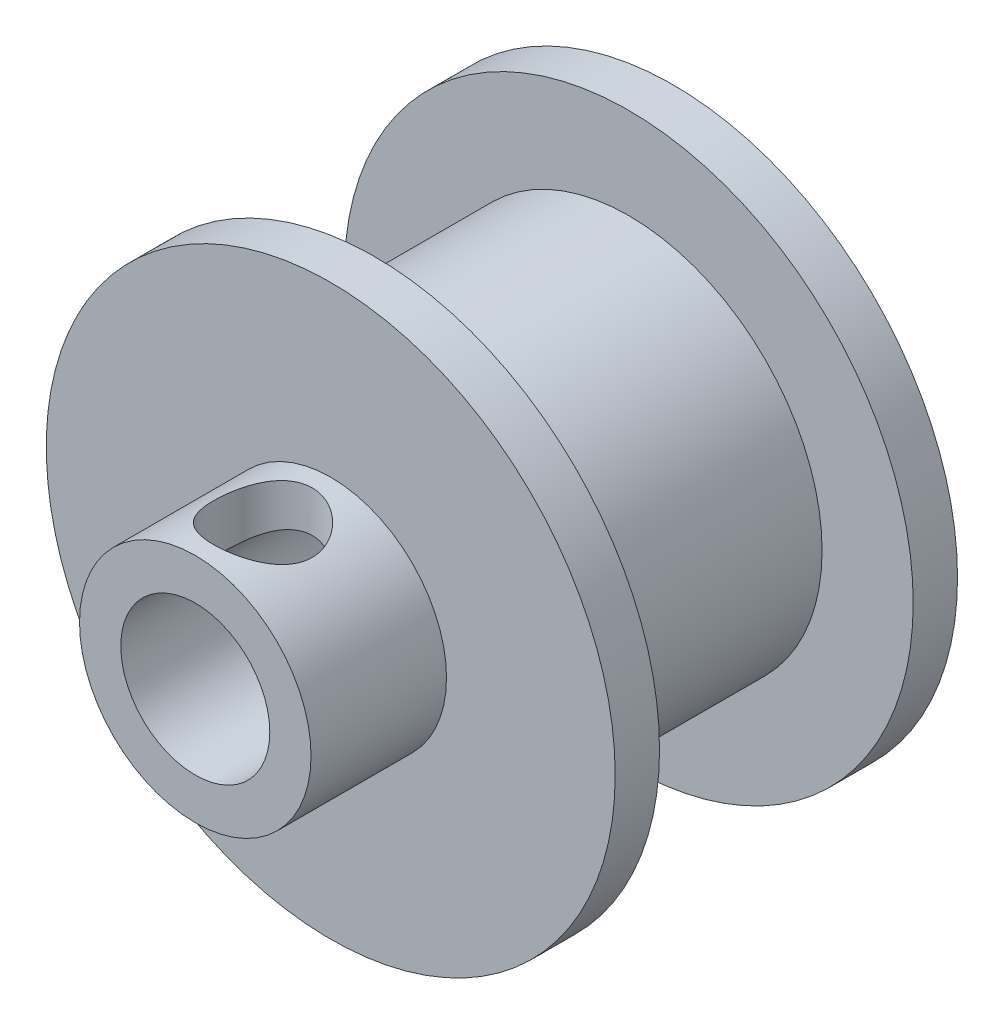
ISO-10303-21;
HEADER;
FILE_DESCRIPTION(('STEP AP214'),'2;1');
FILE_NAME('part.step','',(''),(''),'','','');
FILE_SCHEMA(('AUTOMOTIVE_DESIGN { 1 0 10303 214 1 1 1 1 }'));
ENDSEC;
DATA;
#1=APPLICATION_CONTEXT('core data for automotive mechanical design processes');
#2=APPLICATION_PROTOCOL_DEFINITION('international standard','automotive_design',2000,#1);
#3=PRODUCT_CONTEXT('',#1,'mechanical');
#4=PRODUCT('Part','Part','',(#3));
#5=PRODUCT_RELATED_PRODUCT_CATEGORY('part','',(#4));
#6=PRODUCT_DEFINITION_FORMATION('','',#4);
#7=PRODUCT_DEFINITION_CONTEXT('part definition',#1,'design');
#8=PRODUCT_DEFINITION('design','',#6,#7);
#9=PRODUCT_DEFINITION_SHAPE('','',#8);
#10=(LENGTH_UNIT() NAMED_UNIT(*) SI_UNIT(.MILLI.,.METRE.));
#11=(NAMED_UNIT(*) PLANE_ANGLE_UNIT() SI_UNIT($,.RADIAN.));
#12=(NAMED_UNIT(*) SI_UNIT($,.STERADIAN.) SOLID_ANGLE_UNIT());
#13=UNCERTAINTY_MEASURE_WITH_UNIT(LENGTH_MEASURE(1.E-05),#10,'distance_accuracy_value','');
#14=(GEOMETRIC_REPRESENTATION_CONTEXT(3) GLOBAL_UNCERTAINTY_ASSIGNED_CONTEXT((#13)) GLOBAL_UNIT_ASSIGNED_CONTEXT((#10,
#11,#12)) REPRESENTATION_CONTEXT('',''));
#15=CARTESIAN_POINT('',(0.,0.,0.));
#16=DIRECTION('',(0.,0.,1.));
#17=DIRECTION('',(1.,0.,0.));
#18=AXIS2_PLACEMENT_3D('',#15,#16,#17);
#19=CARTESIAN_POINT('',(0.,0.,6.95));
#20=DIRECTION('',(0.,0.,-1.));
#21=DIRECTION('',(-1.,0.,0.));
#22=AXIS2_PLACEMENT_3D('',#19,#20,#21);
#23=CYLINDRICAL_SURFACE('',#22,3.025);
#24=CARTESIAN_POINT('',(0.,0.,12.45));
#25=DIRECTION('',(0.,0.,1.));
#26=DIRECTION('',(1.,0.,0.));
#27=AXIS2_PLACEMENT_3D('',#24,#25,#26);
#28=CIRCLE('',#27,3.025);
#29=CARTESIAN_POINT('',(3.025,0.,12.45));
#30=VERTEX_POINT('',#29);
#31=EDGE_CURVE('E88',#30,#30,#28,.T.);
#32=ORIENTED_EDGE('',*,*,#31,.T.);
#33=EDGE_LOOP('',(#32));
#34=FACE_BOUND('',#33,.T.);
#35=CARTESIAN_POINT('',(0.,0.,-6.95));
#36=DIRECTION('',(0.,0.,1.));
#37=DIRECTION('',(1.,0.,0.));
#38=AXIS2_PLACEMENT_3D('',#35,#36,#37);
#39=CIRCLE('',#38,3.025);
#40=CARTESIAN_POINT('',(3.025,0.,-6.95));
#41=VERTEX_POINT('',#40);
#42=EDGE_CURVE('E62',#41,#41,#39,.T.);
#43=ORIENTED_EDGE('',*,*,#42,.F.);
#44=EDGE_LOOP('',(#43));
#45=FACE_BOUND('',#44,.T.);
#46=CARTESIAN_POINT('',(0.,3.025,7.7));
#47=CARTESIAN_POINT('',(-0.100642617545443,3.0249987783567,7.70000120399706));
#48=CARTESIAN_POINT('',(-0.201297476451969,3.01993299908086,7.70763918314827));
#49=CARTESIAN_POINT('',(-0.399407420799123,3.00017112360042,7.73772383693425));
#50=CARTESIAN_POINT('',(-0.496860581658116,2.98546934240776,7.76017925352083));
#51=CARTESIAN_POINT('',(-0.685406514791431,2.94788928584531,7.81853239841244));
#52=CARTESIAN_POINT('',(-0.77652679162158,2.9250494038349,7.85436704448431));
#53=CARTESIAN_POINT('',(-0.951102248223408,2.87303630646243,7.93796086625516));
#54=CARTESIAN_POINT('',(-1.03455640299659,2.84386224593824,7.98572163337046));
#55=CARTESIAN_POINT('',(-1.1993664317277,2.77860517215513,8.09619850933004));
#56=CARTESIAN_POINT('',(-1.27995339778043,2.74214718793265,8.15983549631194));
#57=CARTESIAN_POINT('',(-1.43004114549588,2.66695898812271,8.29806837761625));
#58=CARTESIAN_POINT('',(-1.49952590979975,2.62822559792703,8.37267981240007));
#59=CARTESIAN_POINT('',(-1.63642694811529,2.54559569213749,8.54416649867465));
#60=CARTESIAN_POINT('',(-1.70185902015384,2.50182778570157,8.64270030985283));
#61=CARTESIAN_POINT('',(-1.81513895163526,2.42089760145931,8.85185343247864));
#62=CARTESIAN_POINT('',(-1.86301722866889,2.38372395524591,8.96245140311269));
#63=CARTESIAN_POINT('',(-1.92790941909835,2.33131127968343,9.16080288815675));
#64=CARTESIAN_POINT('',(-1.94983031145749,2.3128404086022,9.24608882179241));
#65=CARTESIAN_POINT('',(-1.98230173644163,2.28507624082387,9.42019621834675));
#66=CARTESIAN_POINT('',(-1.99287137832762,2.27576752231628,9.50901147754151));
#67=CARTESIAN_POINT('',(-2.00197996643278,2.26776224993919,9.68810230830303));
#68=CARTESIAN_POINT('',(-2.00047243567843,2.26910669275792,9.77838218574456));
#69=CARTESIAN_POINT('',(-1.98542700585713,2.28227832992203,9.95718548618679));
#70=CARTESIAN_POINT('',(-1.97187893783001,2.29411438504498,10.0457073598269));
#71=CARTESIAN_POINT('',(-1.93441748703559,2.32577203848501,10.2150249556095));
#72=CARTESIAN_POINT('',(-1.91095118389035,2.3452468580049,10.2959886169975));
#73=CARTESIAN_POINT('',(-1.85474587741065,2.38994328199187,10.4529093217787));
#74=CARTESIAN_POINT('',(-1.82200382976829,2.41516677264586,10.5288647113465));
#75=CARTESIAN_POINT('',(-1.74062365832932,2.47464586658619,10.689914970672));
#76=CARTESIAN_POINT('',(-1.69011177897742,2.50969726935146,10.7737667143711));
#77=CARTESIAN_POINT('',(-1.57789269135683,2.58173148940282,10.9327776291153));
#78=CARTESIAN_POINT('',(-1.51617174973991,2.61871663588472,11.0079259496748));
#79=CARTESIAN_POINT('',(-1.36825223388174,2.69944551804657,11.1634469856888));
#80=CARTESIAN_POINT('',(-1.27963305562048,2.74299173909087,11.2416455785507));
#81=CARTESIAN_POINT('',(-1.08829088468167,2.82436277312043,11.3821621524632));
#82=CARTESIAN_POINT('',(-0.985581704313003,2.86219311394096,11.4444955172644));
#83=CARTESIAN_POINT('',(-0.789532778941591,2.92157423058359,11.5401294705185));
#84=CARTESIAN_POINT('',(-0.698331651394651,2.9448638502207,11.5767301836017));
#85=CARTESIAN_POINT('',(-0.509974561365831,2.98324682151488,11.6364045017915));
#86=CARTESIAN_POINT('',(-0.412823666926972,2.99834704378092,11.6594894474371));
#87=CARTESIAN_POINT('',(-0.214732767837397,3.01901724877256,11.6909754675224));
#88=CARTESIAN_POINT('',(-0.11377891660282,3.02454808313808,11.6993162265056));
#89=CARTESIAN_POINT('',(0.08827490320082,3.02539816006898,11.7006024658699));
#90=CARTESIAN_POINT('',(0.189374865880597,3.02071780334157,11.6935485503683));
#91=CARTESIAN_POINT('',(0.381767939018031,3.00226630998737,11.6654713815535));
#92=CARTESIAN_POINT('',(0.473265865733121,2.9891210741874,11.6454093059232));
#93=CARTESIAN_POINT('',(0.651304981345674,2.95544286376606,11.5932545777779));
#94=CARTESIAN_POINT('',(0.737845372463179,2.93490870394887,11.5611599951939));
#95=CARTESIAN_POINT('',(0.909671296368378,2.88645021717455,11.4837986244011));
#96=CARTESIAN_POINT('',(0.994525548315689,2.85813838308447,11.4378228543548));
#97=CARTESIAN_POINT('',(1.15562685582589,2.79688987995517,11.3351349952313));
#98=CARTESIAN_POINT('',(1.23186824324879,2.76395019694144,11.2784159009105));
#99=CARTESIAN_POINT('',(1.38625078703641,2.69023227350938,11.1457657904491));
#100=CARTESIAN_POINT('',(1.46280246171431,2.64903627604967,11.0682160416802));
#101=CARTESIAN_POINT('',(1.60248518218092,2.56694988781008,10.9016111254721));
#102=CARTESIAN_POINT('',(1.66560818311131,2.52605969430337,10.8125491123265));
#103=CARTESIAN_POINT('',(1.77180282800471,2.45256947866062,10.6330116479057));
#104=CARTESIAN_POINT('',(1.81622554222599,2.41955004513944,10.5435113156178));
#105=CARTESIAN_POINT('',(1.89174612763738,2.36097775731043,10.3568040613348));
#106=CARTESIAN_POINT('',(1.92286805386102,2.33541145056868,10.2596114318735));
#107=CARTESIAN_POINT('',(1.96611703059194,2.29905930446256,10.0763918780719));
#108=CARTESIAN_POINT('',(1.98057383955256,2.2864996133779,9.99127578933898));
#109=CARTESIAN_POINT('',(1.99832459579881,2.27100707562216,9.81905002442775));
#110=CARTESIAN_POINT('',(2.00162949221253,2.26806478651924,9.73194238825282));
#111=CARTESIAN_POINT('',(1.99686400840466,2.27226006140056,9.55828636602112));
#112=CARTESIAN_POINT('',(1.98879215912862,2.27939892714264,9.47173805363841));
#113=CARTESIAN_POINT('',(1.96180765860033,2.30265967673578,9.30155537000174));
#114=CARTESIAN_POINT('',(1.94288066764141,2.31879344211434,9.21792500870731));
#115=CARTESIAN_POINT('',(1.88853640463144,2.36338668506866,9.03281773634975));
#116=CARTESIAN_POINT('',(1.85000940230073,2.39401916394776,8.93278671871945));
#117=CARTESIAN_POINT('',(1.75875296775858,2.4618364901973,8.74186280751888));
#118=CARTESIAN_POINT('',(1.70600376756291,2.49903043253554,8.65098287671915));
#119=CARTESIAN_POINT('',(1.58660143921209,2.57652397210842,8.47772806406638));
#120=CARTESIAN_POINT('',(1.51972274368281,2.61686628824137,8.39552830736307));
#121=CARTESIAN_POINT('',(1.37352970310745,2.69647449530486,8.2423909046251));
#122=CARTESIAN_POINT('',(1.29421174234046,2.73574006934783,8.17145654520685));
#123=CARTESIAN_POINT('',(1.11295786075001,2.81477128758288,8.03390374857185));
#124=CARTESIAN_POINT('',(1.00942412682184,2.85394790411945,7.96902276178672));
#125=CARTESIAN_POINT('',(0.789646169800204,2.9223698098855,7.85839465354481));
#126=CARTESIAN_POINT('',(0.673425510575372,2.95163311005191,7.81261279654635));
#127=CARTESIAN_POINT('',(0.463954469027434,2.99057955194841,7.75235804291387));
#128=CARTESIAN_POINT('',(0.372726683285134,3.00339087807589,7.73281288538721));
#129=CARTESIAN_POINT('',(0.187668467681293,3.02059926936491,7.70663698970701));
#130=CARTESIAN_POINT('',(0.0938395550181366,3.02500113906481,7.69999887738861));
#131=CARTESIAN_POINT('',(0.,3.025,7.7));
#132=B_SPLINE_CURVE_WITH_KNOTS('',3,(#46,#47,#48,#49,#50,#51,#52,#53,#54,#55,#56,#57,#58,#59,
#60,#61,#62,#63,#64,#65,#66,#67,#68,#69,#70,#71,#72,#73,#74,#75,#76,#77,#78,#79,#80,#81,#82,#83,
#84,#85,#86,#87,#88,#89,#90,#91,#92,#93,#94,#95,#96,#97,#98,#99,#100,#101,#102,#103,#104,#105,
#106,#107,#108,#109,#110,#111,#112,#113,#114,#115,#116,#117,#118,#119,#120,#121,#122,#123,#124,
#125,#126,#127,#128,#129,#130,#131),.UNSPECIFIED.,.T.,.F.,(4,2,2,2,2,2,2,2,2,2,2,2,2,2,2,2,2,2,
2,2,2,2,2,2,2,2,2,2,2,2,2,2,2,2,2,2,2,2,2,2,2,2,4),(0.,0.3015487261854,0.603275518532284,
0.90359729337094,1.20395916445007,1.5296221539219,1.85575082198353,2.23234945588228,
2.60829239236122,2.87713902044292,3.14553234581872,3.41495903262255,3.68461348298609,
3.94322790551536,4.20192730406332,4.51276392728465,4.8239839889588,5.20005220793538,
5.57575437031097,5.87746307605224,6.17891826595882,6.4816038183107,6.78427749289961,
7.06680260771108,7.3493730602407,7.64994767467169,7.95071895936767,8.29882678891969,
8.64714257948896,8.96167116055969,9.27562847127143,9.53621105204697,9.79653771407238,
10.0568979945935,10.3176030073973,10.6502710247593,10.983403835499,11.3223223758499,
11.6613396128591,12.0440942372523,12.4261496795824,12.7074756225657,12.9886407886918),.UNSPECIFIED.);
#133=CARTESIAN_POINT('',(0.,3.025,7.7));
#134=VERTEX_POINT('',#133);
#135=EDGE_CURVE('E86',#134,#134,#132,.T.);
#136=ORIENTED_EDGE('',*,*,#135,.T.);
#137=EDGE_LOOP('',(#136));
#138=FACE_BOUND('',#137,.T.);
#139=ADVANCED_FACE('F44',(#34,#45,#138),#23,.F.);
#140=CARTESIAN_POINT('',(0.,0.,12.45));
#141=DIRECTION('',(0.,0.,-1.));
#142=DIRECTION('',(-1.,0.,0.));
#143=AXIS2_PLACEMENT_3D('',#140,#141,#142);
#144=CYLINDRICAL_SURFACE('',#143,4.7);
#145=CARTESIAN_POINT('',(0.,0.,12.45));
#146=DIRECTION('',(0.,0.,1.));
#147=DIRECTION('',(1.,0.,0.));
#148=AXIS2_PLACEMENT_3D('',#145,#146,#147);
#149=CIRCLE('',#148,4.7);
#150=CARTESIAN_POINT('',(4.7,0.,12.45));
#151=VERTEX_POINT('',#150);
#152=EDGE_CURVE('E152',#151,#151,#149,.T.);
#153=ORIENTED_EDGE('',*,*,#152,.F.);
#154=EDGE_LOOP('',(#153));
#155=FACE_BOUND('',#154,.T.);
#156=CARTESIAN_POINT('',(0.,0.,6.95));
#157=DIRECTION('',(0.,0.,1.));
#158=DIRECTION('',(1.,0.,0.));
#159=AXIS2_PLACEMENT_3D('',#156,#157,#158);
#160=CIRCLE('',#159,4.7);
#161=CARTESIAN_POINT('',(4.7,0.,6.95));
#162=VERTEX_POINT('',#161);
#163=EDGE_CURVE('E91',#162,#162,#160,.T.);
#164=ORIENTED_EDGE('',*,*,#163,.T.);
#165=EDGE_LOOP('',(#164));
#166=FACE_BOUND('',#165,.T.);
#167=CARTESIAN_POINT('',(0.,4.7,7.7));
#168=CARTESIAN_POINT('',(-0.10692485662613,4.69999666346683,7.70000417760869));
#169=CARTESIAN_POINT('',(-0.214029147523676,4.69630997958722,7.70862509214498));
#170=CARTESIAN_POINT('',(-0.425181969338198,4.68193129468864,7.74277903621876));
#171=CARTESIAN_POINT('',(-0.529222010676268,4.67122145225011,7.76835514001884));
#172=CARTESIAN_POINT('',(-0.730857018166164,4.6439382867363,7.83530438478649));
#173=CARTESIAN_POINT('',(-0.828472851638892,4.62738518558675,7.87662308355906));
#174=CARTESIAN_POINT('',(-1.01528873528886,4.59001917808983,7.97365253204055));
#175=CARTESIAN_POINT('',(-1.10449112492873,4.56920746103547,8.02935926477567));
#176=CARTESIAN_POINT('',(-1.27672442730341,4.52418738012171,8.15663434582691));
#177=CARTESIAN_POINT('',(-1.35926174130374,4.49986471050801,8.2288298481395));
#178=CARTESIAN_POINT('',(-1.51148486557321,4.45104663598243,8.38570539203694));
#179=CARTESIAN_POINT('',(-1.58116363688477,4.42655114403707,8.47039222619485));
#180=CARTESIAN_POINT('',(-1.70926620438313,4.37873614072174,8.65516211964604));
#181=CARTESIAN_POINT('',(-1.76691948260528,4.35554338207605,8.75581566372163));
#182=CARTESIAN_POINT('',(-1.86425663183146,4.31478302503359,8.96651927893424));
#183=CARTESIAN_POINT('',(-1.90395015104001,4.29721240784208,9.07656426701224));
#184=CARTESIAN_POINT('',(-1.96218047468407,4.27092831245099,9.29724464154552));
#185=CARTESIAN_POINT('',(-1.98166946145791,4.26181855593757,9.40757970733334));
#186=CARTESIAN_POINT('',(-2.00190551580218,4.25235376934774,9.630300948235));
#187=CARTESIAN_POINT('',(-2.00266356932707,4.25199360751372,9.74268588235903));
#188=CARTESIAN_POINT('',(-1.98613114332845,4.25973480930859,9.95663895816199));
#189=CARTESIAN_POINT('',(-1.97029063184602,4.26715642894014,10.0583487666607));
#190=CARTESIAN_POINT('',(-1.92345076957673,4.28847200647672,10.2574994197707));
#191=CARTESIAN_POINT('',(-1.89244836602801,4.30236726778646,10.3549394003694));
#192=CARTESIAN_POINT('',(-1.81555525499754,4.33538182828041,10.5452986664836));
#193=CARTESIAN_POINT('',(-1.76935615153357,4.35460791814086,10.6380740220482));
#194=CARTESIAN_POINT('',(-1.6636001351201,4.39609554669109,10.8149264994477));
#195=CARTESIAN_POINT('',(-1.60403783137094,4.41835830896888,10.8990000908782));
#196=CARTESIAN_POINT('',(-1.46706161105033,4.46580649160273,11.0638947819234));
#197=CARTESIAN_POINT('',(-1.38853428286767,4.49107619261281,11.143769424756));
#198=CARTESIAN_POINT('',(-1.21895987758281,4.54003526731224,11.2895413414367));
#199=CARTESIAN_POINT('',(-1.12790962219509,4.56372423754232,11.3554350561332));
#200=CARTESIAN_POINT('',(-0.932892208107861,4.60759525061253,11.4728448716456));
#201=CARTESIAN_POINT('',(-0.828658921880045,4.62767475219198,11.5239601132258));
#202=CARTESIAN_POINT('',(-0.611999597864047,4.66127045529352,11.6075949314454));
#203=CARTESIAN_POINT('',(-0.499578330107226,4.67479044353611,11.6401252388527));
#204=CARTESIAN_POINT('',(-0.277630042436054,4.69302696251971,11.683649108146));
#205=CARTESIAN_POINT('',(-0.168394456422568,4.69826133714206,11.6959118514077));
#206=CARTESIAN_POINT('',(0.0506909318671914,4.70100171313263,11.7023560092764));
#207=CARTESIAN_POINT('',(0.160540537963261,4.69851005621543,11.6965429025652));
#208=CARTESIAN_POINT('',(0.371686977978058,4.68641210333225,11.6678946833195));
#209=CARTESIAN_POINT('',(0.47313081948953,4.67718429534675,11.6459647109599));
#210=CARTESIAN_POINT('',(0.670779642565015,4.65295337017062,11.5869804824908));
#211=CARTESIAN_POINT('',(0.766983967852256,4.63794953139232,11.5499243366647));
#212=CARTESIAN_POINT('',(0.95481713723941,4.60301416311766,11.4605342764179));
#213=CARTESIAN_POINT('',(1.04620957436518,4.58294349394268,11.4077597640921));
#214=CARTESIAN_POINT('',(1.21917036985224,4.53999757346506,11.2889133644913));
#215=CARTESIAN_POINT('',(1.30073453226727,4.5171211326565,11.2228358297364));
#216=CARTESIAN_POINT('',(1.45810635459966,4.46891425913783,11.0735165514297));
#217=CARTESIAN_POINT('',(1.53303460911794,4.44352785937345,10.9893637034481));
#218=CARTESIAN_POINT('',(1.66796692006086,4.3946613909747,10.8093003437844));
#219=CARTESIAN_POINT('',(1.72796702854655,4.3711818277311,10.7133867318083));
#220=CARTESIAN_POINT('',(1.83214915735023,4.32856380704773,10.5102294872308));
#221=CARTESIAN_POINT('',(1.87604556209347,4.30950575213662,10.4028212490079));
#222=CARTESIAN_POINT('',(1.94474056712953,4.27895122845934,10.1810678501511));
#223=CARTESIAN_POINT('',(1.96955583238523,4.26744816264914,10.066728837061));
#224=CARTESIAN_POINT('',(1.99769489254577,4.25434295041792,9.84415969662034));
#225=CARTESIAN_POINT('',(2.00257140660816,4.25202592957534,9.73616724271675));
#226=CARTESIAN_POINT('',(1.99487613358543,4.25564197431861,9.52095810814777));
#227=CARTESIAN_POINT('',(1.9823073158831,4.26157363589046,9.41374129858159));
#228=CARTESIAN_POINT('',(1.94140075202275,4.28035344687555,9.20873501518394));
#229=CARTESIAN_POINT('',(1.91389354633939,4.29283623543807,9.11074306961365));
#230=CARTESIAN_POINT('',(1.84472274227802,4.3230098398554,8.92075278397802));
#231=CARTESIAN_POINT('',(1.8030551310714,4.34070213180871,8.8287561517038));
#232=CARTESIAN_POINT('',(1.70380013805169,4.38064955133802,8.64718446992673));
#233=CARTESIAN_POINT('',(1.64539111331458,4.40311841518084,8.55810652394598));
#234=CARTESIAN_POINT('',(1.51543520489265,4.44951830972454,8.3905312033708));
#235=CARTESIAN_POINT('',(1.4438834576808,4.47344987951198,8.31203776433212));
#236=CARTESIAN_POINT('',(1.28311316784953,4.52230061095796,8.16160685512554));
#237=CARTESIAN_POINT('',(1.19295633781391,4.54715303874267,8.09064571060983));
#238=CARTESIAN_POINT('',(1.00110572168194,4.59320207857633,7.964792782678));
#239=CARTESIAN_POINT('',(0.899406731265102,4.61439703053886,7.90990828842813));
#240=CARTESIAN_POINT('',(0.688754778736438,4.65046916581282,7.81888674411701));
#241=CARTESIAN_POINT('',(0.579934660978088,4.66543698129172,7.78247892162885));
#242=CARTESIAN_POINT('',(0.357118139670209,4.68774068780566,7.72882818466174));
#243=CARTESIAN_POINT('',(0.243138975852847,4.69510028390528,7.71152573169568));
#244=CARTESIAN_POINT('',(0.107217974604443,4.69882649197179,7.70275978030988));
#245=CARTESIAN_POINT('',(0.085791716426806,4.69926588054057,7.70172572561387));
#246=CARTESIAN_POINT('',(0.0429127148599509,4.69985297014782,7.70034541441807));
#247=CARTESIAN_POINT('',(0.0214599713315615,4.70000066964697,7.69999916154797));
#248=CARTESIAN_POINT('',(0.,4.7,7.7));
#249=B_SPLINE_CURVE_WITH_KNOTS('',3,(#167,#168,#169,#170,#171,#172,#173,#174,#175,#176,#177,
#178,#179,#180,#181,#182,#183,#184,#185,#186,#187,#188,#189,#190,#191,#192,#193,#194,#195,#196,
#197,#198,#199,#200,#201,#202,#203,#204,#205,#206,#207,#208,#209,#210,#211,#212,#213,#214,#215,
#216,#217,#218,#219,#220,#221,#222,#223,#224,#225,#226,#227,#228,#229,#230,#231,#232,#233,#234,
#235,#236,#237,#238,#239,#240,#241,#242,#243,#244,#245,#246,#247,#248),.UNSPECIFIED.,.T.,.F.,(4,
2,2,2,2,2,2,2,2,2,2,2,2,2,2,2,2,2,2,2,2,2,2,2,2,2,2,2,2,2,2,2,2,2,2,2,2,2,2,2,4),(0.,
0.320685870740781,0.642189574611706,0.962591377108327,1.28290382361418,1.61841340515282,
1.95410610831837,2.30719760284092,2.66009918637441,2.99548738847847,3.33067887603654,
3.63885054781472,3.94708429379074,4.26200485734005,4.57705269099896,4.91998444470497,
5.26300339473444,5.6146023857879,5.96599816115577,6.29441640325176,6.62273511344724,
6.9339015878588,7.24510694828039,7.56602199898565,7.88707357487126,8.23200483136418,
8.57702721260244,8.92790276334687,9.27847151948977,9.6011503586167,9.92377428107512,
10.2300648758706,10.5364423409171,10.8616669689513,11.1870121912647,11.5375157922178,
11.8881780666705,12.23354123211,12.5778250702761,12.6421868425757,12.7065489545268),.UNSPECIFIED.);
#250=CARTESIAN_POINT('',(0.,4.7,7.7));
#251=VERTEX_POINT('',#250);
#252=EDGE_CURVE('E48',#251,#251,#249,.T.);
#253=ORIENTED_EDGE('',*,*,#252,.F.);
#254=EDGE_LOOP('',(#253));
#255=FACE_BOUND('',#254,.T.);
#256=ADVANCED_FACE('F81',(#155,#166,#255),#144,.T.);
#257=CARTESIAN_POINT('',(0.,0.,6.95));
#258=DIRECTION('',(0.,0.,1.));
#259=DIRECTION('',(1.,0.,0.));
#260=AXIS2_PLACEMENT_3D('',#257,#258,#259);
#261=PLANE('',#260);
#262=CARTESIAN_POINT('',(0.,0.,6.95));
#263=DIRECTION('',(0.,0.,1.));
#264=DIRECTION('',(1.,0.,0.));
#265=AXIS2_PLACEMENT_3D('',#262,#263,#264);
#266=CIRCLE('',#265,11.55);
#267=CARTESIAN_POINT('',(11.55,0.,6.95));
#268=VERTEX_POINT('',#267);
#269=EDGE_CURVE('E12',#268,#268,#266,.T.);
#270=ORIENTED_EDGE('',*,*,#269,.T.);
#271=EDGE_LOOP('',(#270));
#272=FACE_BOUND('',#271,.T.);
#273=ORIENTED_EDGE('',*,*,#163,.F.);
#274=EDGE_LOOP('',(#273));
#275=FACE_BOUND('',#274,.T.);
#276=ADVANCED_FACE('F113',(#272,#275),#261,.T.);
#277=CARTESIAN_POINT('',(0.,0.,6.95));
#278=DIRECTION('',(0.,0.,-1.));
#279=DIRECTION('',(-1.,0.,0.));
#280=AXIS2_PLACEMENT_3D('',#277,#278,#279);
#281=CYLINDRICAL_SURFACE('',#280,11.55);
#282=CARTESIAN_POINT('',(0.,0.,-6.95));
#283=DIRECTION('',(0.,0.,1.));
#284=DIRECTION('',(1.,0.,0.));
#285=AXIS2_PLACEMENT_3D('',#282,#283,#284);
#286=CIRCLE('',#285,11.55);
#287=CARTESIAN_POINT('',(11.55,0.,-6.95));
#288=VERTEX_POINT('',#287);
#289=EDGE_CURVE('E57',#288,#288,#286,.T.);
#290=ORIENTED_EDGE('',*,*,#289,.T.);
#291=EDGE_LOOP('',(#290));
#292=FACE_BOUND('',#291,.T.);
#293=CARTESIAN_POINT('',(0.,0.,-5.15));
#294=DIRECTION('',(0.,0.,1.));
#295=DIRECTION('',(1.,0.,0.));
#296=AXIS2_PLACEMENT_3D('',#293,#294,#295);
#297=CIRCLE('',#296,11.55);
#298=CARTESIAN_POINT('',(11.55,0.,-5.15));
#299=VERTEX_POINT('',#298);
#300=EDGE_CURVE('E69',#299,#299,#297,.T.);
#301=ORIENTED_EDGE('',*,*,#300,.F.);
#302=EDGE_LOOP('',(#301));
#303=FACE_BOUND('',#302,.T.);
#304=ADVANCED_FACE('F134',(#292,#303),#281,.T.);
#305=CARTESIAN_POINT('',(0.,0.,-6.95));
#306=DIRECTION('',(0.,0.,1.));
#307=DIRECTION('',(1.,0.,0.));
#308=AXIS2_PLACEMENT_3D('',#305,#306,#307);
#309=PLANE('',#308);
#310=ORIENTED_EDGE('',*,*,#289,.F.);
#311=EDGE_LOOP('',(#310));
#312=FACE_BOUND('',#311,.T.);
#313=ORIENTED_EDGE('',*,*,#42,.T.);
#314=EDGE_LOOP('',(#313));
#315=FACE_BOUND('',#314,.T.);
#316=ADVANCED_FACE('F77',(#312,#315),#309,.F.);
#317=CARTESIAN_POINT('',(0.,0.,5.15));
#318=DIRECTION('',(0.,0.,1.));
#319=DIRECTION('',(1.,0.,0.));
#320=AXIS2_PLACEMENT_3D('',#317,#318,#319);
#321=CIRCLE('',#320,11.55);
#322=CARTESIAN_POINT('',(11.55,0.,5.15));
#323=VERTEX_POINT('',#322);
#324=EDGE_CURVE('E67',#323,#323,#321,.T.);
#325=ORIENTED_EDGE('',*,*,#324,.T.);
#326=EDGE_LOOP('',(#325));
#327=FACE_BOUND('',#326,.T.);
#328=ORIENTED_EDGE('',*,*,#269,.F.);
#329=EDGE_LOOP('',(#328));
#330=FACE_BOUND('',#329,.T.);
#331=ADVANCED_FACE('F46',(#327,#330),#281,.T.);
#332=CARTESIAN_POINT('',(0.,0.,-5.15));
#333=DIRECTION('',(0.,0.,1.));
#334=DIRECTION('',(1.,0.,0.));
#335=AXIS2_PLACEMENT_3D('',#332,#333,#334);
#336=PLANE('',#335);
#337=CARTESIAN_POINT('',(0.,0.,-5.15));
#338=DIRECTION('',(0.,0.,1.));
#339=DIRECTION('',(1.,0.,0.));
#340=AXIS2_PLACEMENT_3D('',#337,#338,#339);
#341=CIRCLE('',#340,7.85);
#342=CARTESIAN_POINT('',(7.85,0.,-5.15));
#343=VERTEX_POINT('',#342);
#344=EDGE_CURVE('E70',#343,#343,#341,.T.);
#345=ORIENTED_EDGE('',*,*,#344,.F.);
#346=EDGE_LOOP('',(#345));
#347=FACE_BOUND('',#346,.T.);
#348=ORIENTED_EDGE('',*,*,#300,.T.);
#349=EDGE_LOOP('',(#348));
#350=FACE_BOUND('',#349,.T.);
#351=ADVANCED_FACE('F119',(#347,#350),#336,.T.);
#352=CARTESIAN_POINT('',(0.,0.,5.15));
#353=DIRECTION('',(0.,0.,1.));
#354=DIRECTION('',(1.,0.,0.));
#355=AXIS2_PLACEMENT_3D('',#352,#353,#354);
#356=PLANE('',#355);
#357=CARTESIAN_POINT('',(0.,0.,5.15));
#358=DIRECTION('',(0.,0.,1.));
#359=DIRECTION('',(1.,0.,0.));
#360=AXIS2_PLACEMENT_3D('',#357,#358,#359);
#361=CIRCLE('',#360,7.85);
#362=CARTESIAN_POINT('',(7.85,0.,5.15));
#363=VERTEX_POINT('',#362);
#364=EDGE_CURVE('E129',#363,#363,#361,.T.);
#365=ORIENTED_EDGE('',*,*,#364,.T.);
#366=EDGE_LOOP('',(#365));
#367=FACE_BOUND('',#366,.T.);
#368=ORIENTED_EDGE('',*,*,#324,.F.);
#369=EDGE_LOOP('',(#368));
#370=FACE_BOUND('',#369,.T.);
#371=ADVANCED_FACE('F117',(#367,#370),#356,.F.);
#372=CARTESIAN_POINT('',(0.,0.,-5.15));
#373=DIRECTION('',(0.,0.,1.));
#374=DIRECTION('',(1.,0.,0.));
#375=AXIS2_PLACEMENT_3D('',#372,#373,#374);
#376=CYLINDRICAL_SURFACE('',#375,7.85);
#377=CARTESIAN_POINT('',(7.85,0.,-5.15));
#378=CARTESIAN_POINT('',(7.85,0.,-5.04270833333333));
#379=CARTESIAN_POINT('',(7.85,0.,-4.93541666666667));
#380=CARTESIAN_POINT('',(7.85,0.,-4.72083333333333));
#381=CARTESIAN_POINT('',(7.85,0.,-4.61354166666667));
#382=CARTESIAN_POINT('',(7.85,0.,-4.39895833333333));
#383=CARTESIAN_POINT('',(7.85,0.,-4.29166666666667));
#384=CARTESIAN_POINT('',(7.85,0.,-4.07708333333333));
#385=CARTESIAN_POINT('',(7.85,0.,-3.96979166666667));
#386=CARTESIAN_POINT('',(7.85,0.,-3.75520833333333));
#387=CARTESIAN_POINT('',(7.85,0.,-3.64791666666667));
#388=CARTESIAN_POINT('',(7.85,0.,-3.43333333333333));
#389=CARTESIAN_POINT('',(7.85,0.,-3.32604166666667));
#390=CARTESIAN_POINT('',(7.85,0.,-3.11145833333333));
#391=CARTESIAN_POINT('',(7.85,0.,-3.00416666666667));
#392=CARTESIAN_POINT('',(7.85,0.,-2.78958333333333));
#393=CARTESIAN_POINT('',(7.85,0.,-2.68229166666667));
#394=CARTESIAN_POINT('',(7.85,0.,-2.46770833333333));
#395=CARTESIAN_POINT('',(7.85,0.,-2.36041666666667));
#396=CARTESIAN_POINT('',(7.85,0.,-2.14583333333333));
#397=CARTESIAN_POINT('',(7.85,0.,-2.03854166666667));
#398=CARTESIAN_POINT('',(7.85,0.,-1.82395833333333));
#399=CARTESIAN_POINT('',(7.85,0.,-1.71666666666667));
#400=CARTESIAN_POINT('',(7.85,0.,-1.50208333333333));
#401=CARTESIAN_POINT('',(7.85,0.,-1.39479166666667));
#402=CARTESIAN_POINT('',(7.85,0.,-1.18020833333333));
#403=CARTESIAN_POINT('',(7.85,0.,-1.07291666666667));
#404=CARTESIAN_POINT('',(7.85,0.,-0.858333333333335));
#405=CARTESIAN_POINT('',(7.85,0.,-0.751041666666668));
#406=CARTESIAN_POINT('',(7.85,0.,-0.536458333333334));
#407=CARTESIAN_POINT('',(7.85,0.,-0.429166666666668));
#408=CARTESIAN_POINT('',(7.85,0.,-0.214583333333334));
#409=CARTESIAN_POINT('',(7.85,0.,-0.107291666666668));
#410=CARTESIAN_POINT('',(7.85,0.,0.107291666666666));
#411=CARTESIAN_POINT('',(7.85,0.,0.214583333333333));
#412=CARTESIAN_POINT('',(7.85,0.,0.429166666666666));
#413=CARTESIAN_POINT('',(7.85,0.,0.536458333333333));
#414=CARTESIAN_POINT('',(7.85,0.,0.751041666666666));
#415=CARTESIAN_POINT('',(7.85,0.,0.858333333333333));
#416=CARTESIAN_POINT('',(7.85,0.,1.07291666666667));
#417=CARTESIAN_POINT('',(7.85,0.,1.18020833333333));
#418=CARTESIAN_POINT('',(7.85,0.,1.39479166666667));
#419=CARTESIAN_POINT('',(7.85,0.,1.50208333333333));
#420=CARTESIAN_POINT('',(7.85,0.,1.71666666666667));
#421=CARTESIAN_POINT('',(7.85,0.,1.82395833333333));
#422=CARTESIAN_POINT('',(7.85,0.,2.03854166666667));
#423=CARTESIAN_POINT('',(7.85,0.,2.14583333333333));
#424=CARTESIAN_POINT('',(7.85,0.,2.36041666666667));
#425=CARTESIAN_POINT('',(7.85,0.,2.46770833333333));
#426=CARTESIAN_POINT('',(7.85,0.,2.68229166666667));
#427=CARTESIAN_POINT('',(7.85,0.,2.78958333333333));
#428=CARTESIAN_POINT('',(7.85,0.,3.00416666666667));
#429=CARTESIAN_POINT('',(7.85,0.,3.11145833333333));
#430=CARTESIAN_POINT('',(7.85,0.,3.32604166666666));
#431=CARTESIAN_POINT('',(7.85,0.,3.43333333333333));
#432=CARTESIAN_POINT('',(7.85,0.,3.64791666666667));
#433=CARTESIAN_POINT('',(7.85,0.,3.75520833333333));
#434=CARTESIAN_POINT('',(7.85,0.,3.96979166666666));
#435=CARTESIAN_POINT('',(7.85,0.,4.07708333333333));
#436=CARTESIAN_POINT('',(7.85,0.,4.29166666666667));
#437=CARTESIAN_POINT('',(7.85,0.,4.39895833333333));
#438=CARTESIAN_POINT('',(7.85,0.,4.61354166666666));
#439=CARTESIAN_POINT('',(7.85,0.,4.72083333333333));
#440=CARTESIAN_POINT('',(7.85,0.,4.93541666666667));
#441=CARTESIAN_POINT('',(7.85,0.,5.04270833333333));
#442=CARTESIAN_POINT('',(7.85,0.,5.15));
#443=B_SPLINE_CURVE_WITH_KNOTS('',3,(#377,#378,#379,#380,#381,#382,#383,#384,#385,#386,#387,
#388,#389,#390,#391,#392,#393,#394,#395,#396,#397,#398,#399,#400,#401,#402,#403,#404,#405,#406,
#407,#408,#409,#410,#411,#412,#413,#414,#415,#416,#417,#418,#419,#420,#421,#422,#423,#424,#425,
#426,#427,#428,#429,#430,#431,#432,#433,#434,#435,#436,#437,#438,#439,#440,#441,#442),
.UNSPECIFIED.,.F.,.F.,(4,2,2,2,2,2,2,2,2,2,2,2,2,2,2,2,2,2,2,2,2,2,2,2,2,2,2,2,2,2,2,2,4),(0.,
0.321874999999999,0.643749999999999,0.965625,1.2875,1.609375,1.93125,2.253125,2.575,2.896875,
3.21875,3.540625,3.8625,4.184375,4.50625,4.828125,5.15,5.471875,5.79375,6.115625,6.4375,
6.759375,7.08125,7.403125,7.725,8.046875,8.36875,8.690625,9.0125,9.334375,9.65625,9.978125,
10.3),.UNSPECIFIED.);
#444=EDGE_CURVE('BSEAM108',#343,#363,#443,.T.);
#445=ORIENTED_EDGE('',*,*,#344,.T.);
#446=ORIENTED_EDGE('',*,*,#364,.F.);
#447=ORIENTED_EDGE('',*,*,#444,.T.);
#448=ORIENTED_EDGE('',*,*,#444,.F.);
#449=EDGE_LOOP('',(#445,#447,#446,#448));
#450=FACE_BOUND('',#449,.T.);
#451=ADVANCED_FACE('F108',(#450),#376,.T.);
#452=CARTESIAN_POINT('',(0.,0.,12.45));
#453=DIRECTION('',(0.,0.,1.));
#454=DIRECTION('',(1.,0.,0.));
#455=AXIS2_PLACEMENT_3D('',#452,#453,#454);
#456=PLANE('',#455);
#457=ORIENTED_EDGE('',*,*,#152,.T.);
#458=EDGE_LOOP('',(#457));
#459=FACE_BOUND('',#458,.T.);
#460=ORIENTED_EDGE('',*,*,#31,.F.);
#461=EDGE_LOOP('',(#460));
#462=FACE_BOUND('',#461,.T.);
#463=ADVANCED_FACE('F105',(#459,#462),#456,.T.);
#464=CARTESIAN_POINT('',(0.,11.55,9.7));
#465=DIRECTION('',(0.,-1.,0.));
#466=DIRECTION('',(0.,0.,-1.));
#467=AXIS2_PLACEMENT_3D('',#464,#465,#466);
#468=CYLINDRICAL_SURFACE('',#467,2.);
#469=ORIENTED_EDGE('',*,*,#135,.F.);
#470=EDGE_LOOP('',(#469));
#471=FACE_BOUND('',#470,.T.);
#472=ORIENTED_EDGE('',*,*,#252,.T.);
#473=EDGE_LOOP('',(#472));
#474=FACE_BOUND('',#473,.T.);
#475=ADVANCED_FACE('F101',(#471,#474),#468,.F.);
#476=CLOSED_SHELL('',(#139,#256,#276,#304,#316,#331,#351,#371,#451,#463,#475));
#477=MANIFOLD_SOLID_BREP('B2',#476);
#478=ADVANCED_BREP_SHAPE_REPRESENTATION('',(#18,#477),#14);
#479=SHAPE_DEFINITION_REPRESENTATION(#9,#478);
ENDSEC;
END-ISO-10303-21;
